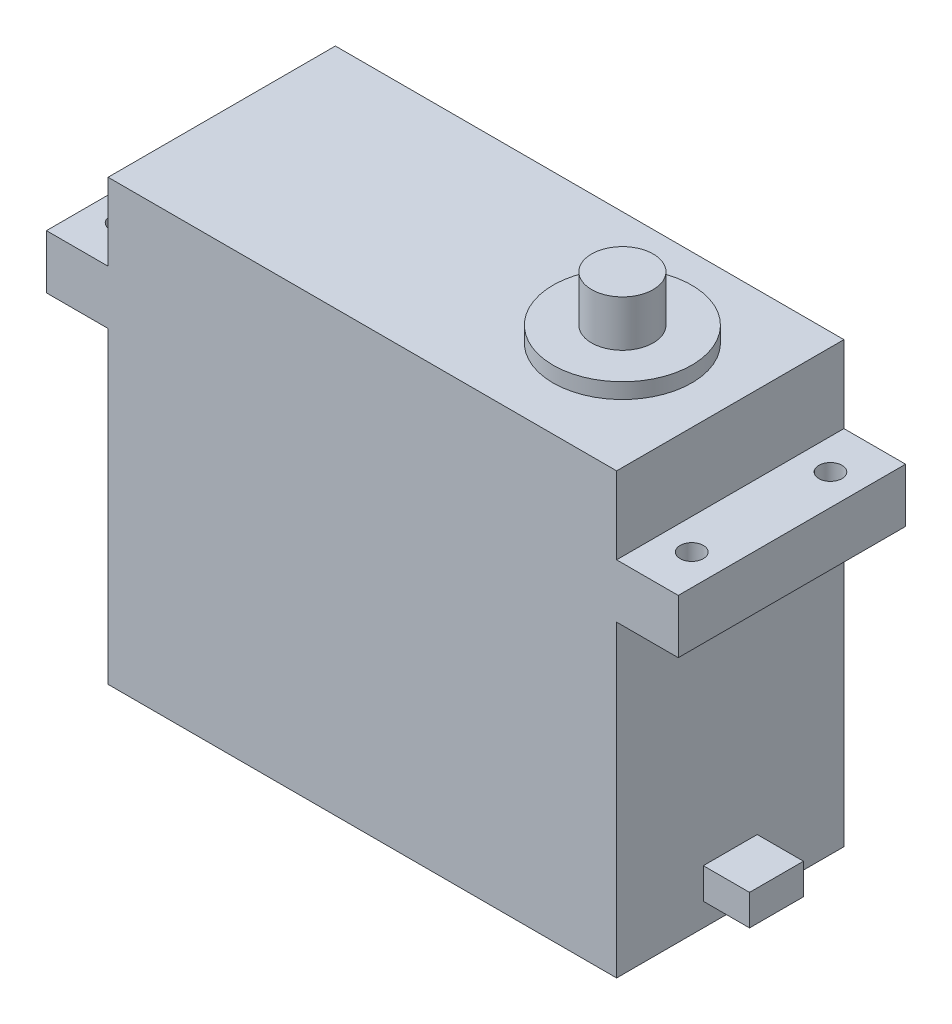
ISO-10303-21;
HEADER;
FILE_DESCRIPTION(('STEP AP214'),'2;1');
FILE_NAME('part.step','',(''),(''),'','','');
FILE_SCHEMA(('AUTOMOTIVE_DESIGN { 1 0 10303 214 1 1 1 1 }'));
ENDSEC;
DATA;
#1=APPLICATION_CONTEXT('core data for automotive mechanical design processes');
#2=APPLICATION_PROTOCOL_DEFINITION('international standard','automotive_design',2000,#1);
#3=PRODUCT_CONTEXT('',#1,'mechanical');
#4=PRODUCT('Part','Part','',(#3));
#5=PRODUCT_RELATED_PRODUCT_CATEGORY('part','',(#4));
#6=PRODUCT_DEFINITION_FORMATION('','',#4);
#7=PRODUCT_DEFINITION_CONTEXT('part definition',#1,'design');
#8=PRODUCT_DEFINITION('design','',#6,#7);
#9=PRODUCT_DEFINITION_SHAPE('','',#8);
#10=(LENGTH_UNIT() NAMED_UNIT(*) SI_UNIT(.MILLI.,.METRE.));
#11=(NAMED_UNIT(*) PLANE_ANGLE_UNIT() SI_UNIT($,.RADIAN.));
#12=(NAMED_UNIT(*) SI_UNIT($,.STERADIAN.) SOLID_ANGLE_UNIT());
#13=UNCERTAINTY_MEASURE_WITH_UNIT(LENGTH_MEASURE(1.E-05),#10,'distance_accuracy_value','');
#14=(GEOMETRIC_REPRESENTATION_CONTEXT(3) GLOBAL_UNCERTAINTY_ASSIGNED_CONTEXT((#13)) GLOBAL_UNIT_ASSIGNED_CONTEXT((#10,
#11,#12)) REPRESENTATION_CONTEXT('',''));
#15=CARTESIAN_POINT('',(0.,0.,0.));
#16=DIRECTION('',(0.,0.,1.));
#17=DIRECTION('',(1.,0.,0.));
#18=AXIS2_PLACEMENT_3D('',#15,#16,#17);
#19=CARTESIAN_POINT('',(14.,57.,-14.75));
#20=DIRECTION('',(-1.,0.,0.));
#21=DIRECTION('',(0.,0.,1.));
#22=AXIS2_PLACEMENT_3D('',#19,#20,#21);
#23=PLANE('',#22);
#24=DIRECTION('',(0.,-1.,0.));
#25=VECTOR('',#24,1.);
#26=CARTESIAN_POINT('',(14.,57.,-14.75));
#27=LINE('',#26,#25);
#28=CARTESIAN_POINT('',(14.,40.,-14.75));
#29=VERTEX_POINT('',#28);
#30=CARTESIAN_POINT('',(14.,0.,-14.75));
#31=VERTEX_POINT('',#30);
#32=EDGE_CURVE('E278',#29,#31,#27,.T.);
#33=ORIENTED_EDGE('',*,*,#32,.F.);
#34=DIRECTION('',(0.,0.,1.));
#35=VECTOR('',#34,1.);
#36=CARTESIAN_POINT('',(14.,40.,-14.75));
#37=LINE('',#36,#35);
#38=CARTESIAN_POINT('',(14.,40.,14.75));
#39=VERTEX_POINT('',#38);
#40=EDGE_CURVE('E231',#29,#39,#37,.T.);
#41=ORIENTED_EDGE('',*,*,#40,.T.);
#42=DIRECTION('',(0.,-1.,0.));
#43=VECTOR('',#42,1.);
#44=CARTESIAN_POINT('',(14.,57.,14.75));
#45=LINE('',#44,#43);
#46=CARTESIAN_POINT('',(14.,0.,14.75));
#47=VERTEX_POINT('',#46);
#48=EDGE_CURVE('E281',#39,#47,#45,.T.);
#49=ORIENTED_EDGE('',*,*,#48,.T.);
#50=DIRECTION('',(0.,0.,-1.));
#51=VECTOR('',#50,1.);
#52=CARTESIAN_POINT('',(14.,0.,-14.75));
#53=LINE('',#52,#51);
#54=EDGE_CURVE('E271',#47,#31,#53,.T.);
#55=ORIENTED_EDGE('',*,*,#54,.T.);
#56=EDGE_LOOP('',(#33,#41,#49,#55));
#57=FACE_BOUND('',#56,.T.);
#58=DIRECTION('',(0.,-1.,0.));
#59=VECTOR('',#58,1.);
#60=CARTESIAN_POINT('',(14.,7.,3.5));
#61=LINE('',#60,#59);
#62=CARTESIAN_POINT('',(14.,7.,3.5));
#63=VERTEX_POINT('',#62);
#64=CARTESIAN_POINT('',(14.,3.,3.5));
#65=VERTEX_POINT('',#64);
#66=EDGE_CURVE('E165',#63,#65,#61,.T.);
#67=ORIENTED_EDGE('',*,*,#66,.F.);
#68=DIRECTION('',(0.,0.,1.));
#69=VECTOR('',#68,1.);
#70=CARTESIAN_POINT('',(14.,7.,3.5));
#71=LINE('',#70,#69);
#72=CARTESIAN_POINT('',(14.,7.,-3.5));
#73=VERTEX_POINT('',#72);
#74=EDGE_CURVE('E162',#73,#63,#71,.T.);
#75=ORIENTED_EDGE('',*,*,#74,.F.);
#76=DIRECTION('',(0.,1.,0.));
#77=VECTOR('',#76,1.);
#78=CARTESIAN_POINT('',(14.,7.,-3.5));
#79=LINE('',#78,#77);
#80=CARTESIAN_POINT('',(14.,3.,-3.5));
#81=VERTEX_POINT('',#80);
#82=EDGE_CURVE('E52',#81,#73,#79,.T.);
#83=ORIENTED_EDGE('',*,*,#82,.F.);
#84=DIRECTION('',(0.,0.,-1.));
#85=VECTOR('',#84,1.);
#86=CARTESIAN_POINT('',(14.,3.,3.5));
#87=LINE('',#86,#85);
#88=EDGE_CURVE('E47',#65,#81,#87,.T.);
#89=ORIENTED_EDGE('',*,*,#88,.F.);
#90=EDGE_LOOP('',(#67,#75,#83,#89));
#91=FACE_BOUND('',#90,.T.);
#92=ADVANCED_FACE('F32',(#57,#91),#23,.F.);
#93=CARTESIAN_POINT('',(-52.,57.,-14.75));
#94=DIRECTION('',(1.,0.,0.));
#95=DIRECTION('',(0.,0.,-1.));
#96=AXIS2_PLACEMENT_3D('',#93,#94,#95);
#97=PLANE('',#96);
#98=DIRECTION('',(0.,0.,-1.));
#99=VECTOR('',#98,1.);
#100=CARTESIAN_POINT('',(-52.,47.,-14.75));
#101=LINE('',#100,#99);
#102=CARTESIAN_POINT('',(-52.,47.,14.75));
#103=VERTEX_POINT('',#102);
#104=CARTESIAN_POINT('',(-52.,47.,-14.75));
#105=VERTEX_POINT('',#104);
#106=EDGE_CURVE('E239',#103,#105,#101,.T.);
#107=ORIENTED_EDGE('',*,*,#106,.F.);
#108=DIRECTION('',(0.,-1.,0.));
#109=VECTOR('',#108,1.);
#110=CARTESIAN_POINT('',(-52.,57.,14.75));
#111=LINE('',#110,#109);
#112=CARTESIAN_POINT('',(-52.,57.,14.75));
#113=VERTEX_POINT('',#112);
#114=EDGE_CURVE('E11',#113,#103,#111,.T.);
#115=ORIENTED_EDGE('',*,*,#114,.F.);
#116=DIRECTION('',(0.,0.,1.));
#117=VECTOR('',#116,1.);
#118=CARTESIAN_POINT('',(-52.,57.,-14.75));
#119=LINE('',#118,#117);
#120=CARTESIAN_POINT('',(-52.,57.,-14.75));
#121=VERTEX_POINT('',#120);
#122=EDGE_CURVE('E255',#121,#113,#119,.T.);
#123=ORIENTED_EDGE('',*,*,#122,.F.);
#124=DIRECTION('',(0.,-1.,0.));
#125=VECTOR('',#124,1.);
#126=CARTESIAN_POINT('',(-52.,57.,-14.75));
#127=LINE('',#126,#125);
#128=EDGE_CURVE('E276',#121,#105,#127,.T.);
#129=ORIENTED_EDGE('',*,*,#128,.T.);
#130=EDGE_LOOP('',(#107,#115,#123,#129));
#131=FACE_BOUND('',#130,.T.);
#132=ADVANCED_FACE('F325',(#131),#97,.F.);
#133=DIRECTION('',(0.,0.,1.));
#134=VECTOR('',#133,1.);
#135=CARTESIAN_POINT('',(14.,47.,-14.75));
#136=LINE('',#135,#134);
#137=CARTESIAN_POINT('',(14.,47.,-14.75));
#138=VERTEX_POINT('',#137);
#139=CARTESIAN_POINT('',(14.,47.,14.75));
#140=VERTEX_POINT('',#139);
#141=EDGE_CURVE('E237',#138,#140,#136,.T.);
#142=ORIENTED_EDGE('',*,*,#141,.F.);
#143=CARTESIAN_POINT('',(14.,57.,-14.75));
#144=VERTEX_POINT('',#143);
#145=EDGE_CURVE('E279',#144,#138,#27,.T.);
#146=ORIENTED_EDGE('',*,*,#145,.F.);
#147=DIRECTION('',(0.,0.,-1.));
#148=VECTOR('',#147,1.);
#149=CARTESIAN_POINT('',(14.,57.,-14.75));
#150=LINE('',#149,#148);
#151=CARTESIAN_POINT('',(14.,57.,14.75));
#152=VERTEX_POINT('',#151);
#153=EDGE_CURVE('E261',#152,#144,#150,.T.);
#154=ORIENTED_EDGE('',*,*,#153,.F.);
#155=EDGE_CURVE('E282',#152,#140,#45,.T.);
#156=ORIENTED_EDGE('',*,*,#155,.T.);
#157=EDGE_LOOP('',(#142,#146,#154,#156));
#158=FACE_BOUND('',#157,.T.);
#159=ADVANCED_FACE('F316',(#158),#23,.F.);
#160=CARTESIAN_POINT('',(0.,59.,0.));
#161=DIRECTION('',(0.,1.,0.));
#162=DIRECTION('',(0.,0.,1.));
#163=AXIS2_PLACEMENT_3D('',#160,#161,#162);
#164=PLANE('',#163);
#165=CARTESIAN_POINT('',(0.,59.,0.));
#166=DIRECTION('',(0.,1.,0.));
#167=DIRECTION('',(0.,0.,1.));
#168=AXIS2_PLACEMENT_3D('',#165,#166,#167);
#169=CIRCLE('',#168,9.);
#170=CARTESIAN_POINT('',(0.,59.,9.));
#171=VERTEX_POINT('',#170);
#172=EDGE_CURVE('E249',#171,#171,#169,.T.);
#173=ORIENTED_EDGE('',*,*,#172,.T.);
#174=EDGE_LOOP('',(#173));
#175=FACE_BOUND('',#174,.T.);
#176=CARTESIAN_POINT('',(0.,59.,0.));
#177=DIRECTION('',(0.,1.,0.));
#178=DIRECTION('',(0.,0.,1.));
#179=AXIS2_PLACEMENT_3D('',#176,#177,#178);
#180=CIRCLE('',#179,4.);
#181=CARTESIAN_POINT('',(0.,59.,4.));
#182=VERTEX_POINT('',#181);
#183=EDGE_CURVE('E242',#182,#182,#180,.T.);
#184=ORIENTED_EDGE('',*,*,#183,.F.);
#185=EDGE_LOOP('',(#184));
#186=FACE_BOUND('',#185,.T.);
#187=ADVANCED_FACE('F345',(#175,#186),#164,.T.);
#188=CARTESIAN_POINT('',(0.,57.,0.));
#189=DIRECTION('',(0.,1.,0.));
#190=DIRECTION('',(0.,0.,1.));
#191=AXIS2_PLACEMENT_3D('',#188,#189,#190);
#192=PLANE('',#191);
#193=ORIENTED_EDGE('',*,*,#122,.T.);
#194=DIRECTION('',(1.,0.,0.));
#195=VECTOR('',#194,1.);
#196=CARTESIAN_POINT('',(-52.,57.,14.75));
#197=LINE('',#196,#195);
#198=EDGE_CURVE('E258',#113,#152,#197,.T.);
#199=ORIENTED_EDGE('',*,*,#198,.T.);
#200=ORIENTED_EDGE('',*,*,#153,.T.);
#201=DIRECTION('',(-1.,0.,0.));
#202=VECTOR('',#201,1.);
#203=CARTESIAN_POINT('',(-52.,57.,-14.75));
#204=LINE('',#203,#202);
#205=EDGE_CURVE('E263',#144,#121,#204,.T.);
#206=ORIENTED_EDGE('',*,*,#205,.T.);
#207=EDGE_LOOP('',(#193,#199,#200,#206));
#208=FACE_BOUND('',#207,.T.);
#209=CARTESIAN_POINT('',(0.,57.,0.));
#210=DIRECTION('',(0.,1.,0.));
#211=DIRECTION('',(0.,0.,1.));
#212=AXIS2_PLACEMENT_3D('',#209,#210,#211);
#213=CIRCLE('',#212,9.);
#214=CARTESIAN_POINT('',(0.,57.,9.));
#215=VERTEX_POINT('',#214);
#216=EDGE_CURVE('E246',#215,#215,#213,.T.);
#217=ORIENTED_EDGE('',*,*,#216,.F.);
#218=EDGE_LOOP('',(#217));
#219=FACE_BOUND('',#218,.T.);
#220=ADVANCED_FACE('F319',(#208,#219),#192,.T.);
#221=CARTESIAN_POINT('',(-52.,40.,14.75));
#222=VERTEX_POINT('',#221);
#223=CARTESIAN_POINT('',(-52.,0.,14.75));
#224=VERTEX_POINT('',#223);
#225=EDGE_CURVE('E40',#222,#224,#111,.T.);
#226=ORIENTED_EDGE('',*,*,#225,.F.);
#227=DIRECTION('',(0.,0.,-1.));
#228=VECTOR('',#227,1.);
#229=CARTESIAN_POINT('',(-52.,40.,-14.75));
#230=LINE('',#229,#228);
#231=CARTESIAN_POINT('',(-52.,40.,-14.75));
#232=VERTEX_POINT('',#231);
#233=EDGE_CURVE('E234',#222,#232,#230,.T.);
#234=ORIENTED_EDGE('',*,*,#233,.T.);
#235=CARTESIAN_POINT('',(-52.,0.,-14.75));
#236=VERTEX_POINT('',#235);
#237=EDGE_CURVE('E265',#232,#236,#127,.T.);
#238=ORIENTED_EDGE('',*,*,#237,.T.);
#239=DIRECTION('',(0.,0.,1.));
#240=VECTOR('',#239,1.);
#241=CARTESIAN_POINT('',(-52.,0.,-14.75));
#242=LINE('',#241,#240);
#243=EDGE_CURVE('E252',#236,#224,#242,.T.);
#244=ORIENTED_EDGE('',*,*,#243,.T.);
#245=EDGE_LOOP('',(#226,#234,#238,#244));
#246=FACE_BOUND('',#245,.T.);
#247=ADVANCED_FACE('F34',(#246),#97,.F.);
#248=CARTESIAN_POINT('',(-52.,57.,14.75));
#249=DIRECTION('',(0.,0.,-1.));
#250=DIRECTION('',(-1.,0.,0.));
#251=AXIS2_PLACEMENT_3D('',#248,#249,#250);
#252=PLANE('',#251);
#253=ORIENTED_EDGE('',*,*,#48,.F.);
#254=DIRECTION('',(1.,0.,0.));
#255=VECTOR('',#254,1.);
#256=CARTESIAN_POINT('',(-60.,40.,14.75));
#257=LINE('',#256,#255);
#258=CARTESIAN_POINT('',(22.,40.,14.75));
#259=VERTEX_POINT('',#258);
#260=EDGE_CURVE('E212',#39,#259,#257,.T.);
#261=ORIENTED_EDGE('',*,*,#260,.T.);
#262=DIRECTION('',(0.,-1.,0.));
#263=VECTOR('',#262,1.);
#264=CARTESIAN_POINT('',(22.,47.,14.75));
#265=LINE('',#264,#263);
#266=CARTESIAN_POINT('',(22.,47.,14.75));
#267=VERTEX_POINT('',#266);
#268=EDGE_CURVE('E225',#267,#259,#265,.T.);
#269=ORIENTED_EDGE('',*,*,#268,.F.);
#270=DIRECTION('',(1.,0.,0.));
#271=VECTOR('',#270,1.);
#272=CARTESIAN_POINT('',(-60.,47.,14.75));
#273=LINE('',#272,#271);
#274=EDGE_CURVE('E199',#140,#267,#273,.T.);
#275=ORIENTED_EDGE('',*,*,#274,.F.);
#276=ORIENTED_EDGE('',*,*,#155,.F.);
#277=ORIENTED_EDGE('',*,*,#198,.F.);
#278=ORIENTED_EDGE('',*,*,#114,.T.);
#279=CARTESIAN_POINT('',(-60.,47.,14.75));
#280=VERTEX_POINT('',#279);
#281=EDGE_CURVE('E201',#280,#103,#273,.T.);
#282=ORIENTED_EDGE('',*,*,#281,.F.);
#283=DIRECTION('',(0.,-1.,0.));
#284=VECTOR('',#283,1.);
#285=CARTESIAN_POINT('',(-60.,47.,14.75));
#286=LINE('',#285,#284);
#287=CARTESIAN_POINT('',(-60.,40.,14.75));
#288=VERTEX_POINT('',#287);
#289=EDGE_CURVE('E228',#280,#288,#286,.T.);
#290=ORIENTED_EDGE('',*,*,#289,.T.);
#291=EDGE_CURVE('E213',#288,#222,#257,.T.);
#292=ORIENTED_EDGE('',*,*,#291,.T.);
#293=ORIENTED_EDGE('',*,*,#225,.T.);
#294=DIRECTION('',(1.,0.,0.));
#295=VECTOR('',#294,1.);
#296=CARTESIAN_POINT('',(-52.,0.,14.75));
#297=LINE('',#296,#295);
#298=EDGE_CURVE('E268',#224,#47,#297,.T.);
#299=ORIENTED_EDGE('',*,*,#298,.T.);
#300=EDGE_LOOP('',(#253,#261,#269,#275,#276,#277,#278,#282,#290,#292,#293,#299));
#301=FACE_BOUND('',#300,.T.);
#302=ADVANCED_FACE('F296',(#301),#252,.F.);
#303=CARTESIAN_POINT('',(-52.,57.,-14.75));
#304=DIRECTION('',(0.,0.,1.));
#305=DIRECTION('',(1.,0.,0.));
#306=AXIS2_PLACEMENT_3D('',#303,#304,#305);
#307=PLANE('',#306);
#308=ORIENTED_EDGE('',*,*,#237,.F.);
#309=DIRECTION('',(-1.,0.,0.));
#310=VECTOR('',#309,1.);
#311=CARTESIAN_POINT('',(-60.,40.,-14.75));
#312=LINE('',#311,#310);
#313=CARTESIAN_POINT('',(-60.,40.,-14.75));
#314=VERTEX_POINT('',#313);
#315=EDGE_CURVE('E218',#232,#314,#312,.T.);
#316=ORIENTED_EDGE('',*,*,#315,.T.);
#317=DIRECTION('',(0.,-1.,0.));
#318=VECTOR('',#317,1.);
#319=CARTESIAN_POINT('',(-60.,47.,-14.75));
#320=LINE('',#319,#318);
#321=CARTESIAN_POINT('',(-60.,47.,-14.75));
#322=VERTEX_POINT('',#321);
#323=EDGE_CURVE('E209',#322,#314,#320,.T.);
#324=ORIENTED_EDGE('',*,*,#323,.F.);
#325=DIRECTION('',(-1.,0.,0.));
#326=VECTOR('',#325,1.);
#327=CARTESIAN_POINT('',(-60.,47.,-14.75));
#328=LINE('',#327,#326);
#329=EDGE_CURVE('E206',#105,#322,#328,.T.);
#330=ORIENTED_EDGE('',*,*,#329,.F.);
#331=ORIENTED_EDGE('',*,*,#128,.F.);
#332=ORIENTED_EDGE('',*,*,#205,.F.);
#333=ORIENTED_EDGE('',*,*,#145,.T.);
#334=CARTESIAN_POINT('',(22.,47.,-14.75));
#335=VERTEX_POINT('',#334);
#336=EDGE_CURVE('E207',#335,#138,#328,.T.);
#337=ORIENTED_EDGE('',*,*,#336,.F.);
#338=DIRECTION('',(0.,-1.,0.));
#339=VECTOR('',#338,1.);
#340=CARTESIAN_POINT('',(22.,47.,-14.75));
#341=LINE('',#340,#339);
#342=CARTESIAN_POINT('',(22.,40.,-14.75));
#343=VERTEX_POINT('',#342);
#344=EDGE_CURVE('E222',#335,#343,#341,.T.);
#345=ORIENTED_EDGE('',*,*,#344,.T.);
#346=EDGE_CURVE('E200',#343,#29,#312,.T.);
#347=ORIENTED_EDGE('',*,*,#346,.T.);
#348=ORIENTED_EDGE('',*,*,#32,.T.);
#349=DIRECTION('',(-1.,0.,0.));
#350=VECTOR('',#349,1.);
#351=CARTESIAN_POINT('',(-52.,0.,-14.75));
#352=LINE('',#351,#350);
#353=EDGE_CURVE('E259',#31,#236,#352,.T.);
#354=ORIENTED_EDGE('',*,*,#353,.T.);
#355=EDGE_LOOP('',(#308,#316,#324,#330,#331,#332,#333,#337,#345,#347,#348,#354));
#356=FACE_BOUND('',#355,.T.);
#357=ADVANCED_FACE('F301',(#356),#307,.F.);
#358=CARTESIAN_POINT('',(0.,0.,0.));
#359=DIRECTION('',(0.,1.,0.));
#360=DIRECTION('',(0.,0.,1.));
#361=AXIS2_PLACEMENT_3D('',#358,#359,#360);
#362=PLANE('',#361);
#363=ORIENTED_EDGE('',*,*,#243,.F.);
#364=ORIENTED_EDGE('',*,*,#353,.F.);
#365=ORIENTED_EDGE('',*,*,#54,.F.);
#366=ORIENTED_EDGE('',*,*,#298,.F.);
#367=EDGE_LOOP('',(#363,#364,#365,#366));
#368=FACE_BOUND('',#367,.T.);
#369=ADVANCED_FACE('F299',(#368),#362,.F.);
#370=CARTESIAN_POINT('',(0.,59.,0.));
#371=DIRECTION('',(0.,-1.,0.));
#372=DIRECTION('',(0.,0.,-1.));
#373=AXIS2_PLACEMENT_3D('',#370,#371,#372);
#374=CYLINDRICAL_SURFACE('',#373,9.);
#375=ORIENTED_EDGE('',*,*,#172,.F.);
#376=EDGE_LOOP('',(#375));
#377=FACE_BOUND('',#376,.T.);
#378=ORIENTED_EDGE('',*,*,#216,.T.);
#379=EDGE_LOOP('',(#378));
#380=FACE_BOUND('',#379,.T.);
#381=ADVANCED_FACE('F366',(#377,#380),#374,.T.);
#382=CARTESIAN_POINT('',(0.,65.,0.));
#383=DIRECTION('',(0.,-1.,0.));
#384=DIRECTION('',(0.,0.,-1.));
#385=AXIS2_PLACEMENT_3D('',#382,#383,#384);
#386=CYLINDRICAL_SURFACE('',#385,4.);
#387=CARTESIAN_POINT('',(0.,65.,0.));
#388=DIRECTION('',(0.,1.,0.));
#389=DIRECTION('',(0.,0.,1.));
#390=AXIS2_PLACEMENT_3D('',#387,#388,#389);
#391=CIRCLE('',#390,4.);
#392=CARTESIAN_POINT('',(0.,65.,4.));
#393=VERTEX_POINT('',#392);
#394=EDGE_CURVE('E243',#393,#393,#391,.T.);
#395=ORIENTED_EDGE('',*,*,#394,.F.);
#396=EDGE_LOOP('',(#395));
#397=FACE_BOUND('',#396,.T.);
#398=ORIENTED_EDGE('',*,*,#183,.T.);
#399=EDGE_LOOP('',(#398));
#400=FACE_BOUND('',#399,.T.);
#401=ADVANCED_FACE('F364',(#397,#400),#386,.T.);
#402=CARTESIAN_POINT('',(0.,65.,0.));
#403=DIRECTION('',(0.,1.,0.));
#404=DIRECTION('',(0.,0.,1.));
#405=AXIS2_PLACEMENT_3D('',#402,#403,#404);
#406=PLANE('',#405);
#407=ORIENTED_EDGE('',*,*,#394,.T.);
#408=EDGE_LOOP('',(#407));
#409=FACE_BOUND('',#408,.T.);
#410=ADVANCED_FACE('F392',(#409),#406,.T.);
#411=CARTESIAN_POINT('',(18.,47.,9.));
#412=DIRECTION('',(0.,-1.,0.));
#413=DIRECTION('',(0.,0.,-1.));
#414=AXIS2_PLACEMENT_3D('',#411,#412,#413);
#415=CYLINDRICAL_SURFACE('',#414,1.5);
#416=CARTESIAN_POINT('',(18.,47.,9.));
#417=DIRECTION('',(0.,1.,0.));
#418=DIRECTION('',(0.,0.,1.));
#419=AXIS2_PLACEMENT_3D('',#416,#417,#418);
#420=CIRCLE('',#419,1.5);
#421=CARTESIAN_POINT('',(18.,47.,10.5));
#422=VERTEX_POINT('',#421);
#423=EDGE_CURVE('E178',#422,#422,#420,.T.);
#424=ORIENTED_EDGE('',*,*,#423,.T.);
#425=EDGE_LOOP('',(#424));
#426=FACE_BOUND('',#425,.T.);
#427=CARTESIAN_POINT('',(18.,40.,9.));
#428=DIRECTION('',(0.,1.,0.));
#429=DIRECTION('',(0.,0.,1.));
#430=AXIS2_PLACEMENT_3D('',#427,#428,#429);
#431=CIRCLE('',#430,1.5);
#432=CARTESIAN_POINT('',(18.,40.,10.5));
#433=VERTEX_POINT('',#432);
#434=EDGE_CURVE('E176',#433,#433,#431,.T.);
#435=ORIENTED_EDGE('',*,*,#434,.F.);
#436=EDGE_LOOP('',(#435));
#437=FACE_BOUND('',#436,.T.);
#438=ADVANCED_FACE('F399',(#426,#437),#415,.F.);
#439=CARTESIAN_POINT('',(18.,47.,-9.));
#440=DIRECTION('',(0.,-1.,0.));
#441=DIRECTION('',(0.,0.,-1.));
#442=AXIS2_PLACEMENT_3D('',#439,#440,#441);
#443=CYLINDRICAL_SURFACE('',#442,1.5);
#444=CARTESIAN_POINT('',(18.,47.,-9.));
#445=DIRECTION('',(0.,1.,0.));
#446=DIRECTION('',(0.,0.,-1.));
#447=AXIS2_PLACEMENT_3D('',#444,#445,#446);
#448=CIRCLE('',#447,1.5);
#449=CARTESIAN_POINT('',(18.,47.,-10.5));
#450=VERTEX_POINT('',#449);
#451=EDGE_CURVE('E169',#450,#450,#448,.T.);
#452=ORIENTED_EDGE('',*,*,#451,.T.);
#453=EDGE_LOOP('',(#452));
#454=FACE_BOUND('',#453,.T.);
#455=CARTESIAN_POINT('',(18.,40.,-9.));
#456=DIRECTION('',(0.,1.,0.));
#457=DIRECTION('',(0.,0.,-1.));
#458=AXIS2_PLACEMENT_3D('',#455,#456,#457);
#459=CIRCLE('',#458,1.5);
#460=CARTESIAN_POINT('',(18.,40.,-10.5));
#461=VERTEX_POINT('',#460);
#462=EDGE_CURVE('E166',#461,#461,#459,.T.);
#463=ORIENTED_EDGE('',*,*,#462,.F.);
#464=EDGE_LOOP('',(#463));
#465=FACE_BOUND('',#464,.T.);
#466=ADVANCED_FACE('F406',(#454,#465),#443,.F.);
#467=CARTESIAN_POINT('',(22.,47.,14.75));
#468=DIRECTION('',(-1.,0.,0.));
#469=DIRECTION('',(0.,0.,1.));
#470=AXIS2_PLACEMENT_3D('',#467,#468,#469);
#471=PLANE('',#470);
#472=DIRECTION('',(0.,0.,-1.));
#473=VECTOR('',#472,1.);
#474=CARTESIAN_POINT('',(22.,40.,14.75));
#475=LINE('',#474,#473);
#476=EDGE_CURVE('E216',#259,#343,#475,.T.);
#477=ORIENTED_EDGE('',*,*,#476,.T.);
#478=ORIENTED_EDGE('',*,*,#344,.F.);
#479=DIRECTION('',(0.,0.,-1.));
#480=VECTOR('',#479,1.);
#481=CARTESIAN_POINT('',(22.,47.,14.75));
#482=LINE('',#481,#480);
#483=EDGE_CURVE('E204',#267,#335,#482,.T.);
#484=ORIENTED_EDGE('',*,*,#483,.F.);
#485=ORIENTED_EDGE('',*,*,#268,.T.);
#486=EDGE_LOOP('',(#477,#478,#484,#485));
#487=FACE_BOUND('',#486,.T.);
#488=ADVANCED_FACE('F312',(#487),#471,.F.);
#489=CARTESIAN_POINT('',(0.,40.,0.));
#490=DIRECTION('',(0.,-1.,0.));
#491=DIRECTION('',(0.,0.,-1.));
#492=AXIS2_PLACEMENT_3D('',#489,#490,#491);
#493=PLANE('',#492);
#494=ORIENTED_EDGE('',*,*,#462,.T.);
#495=EDGE_LOOP('',(#494));
#496=FACE_BOUND('',#495,.T.);
#497=ORIENTED_EDGE('',*,*,#434,.T.);
#498=EDGE_LOOP('',(#497));
#499=FACE_BOUND('',#498,.T.);
#500=ORIENTED_EDGE('',*,*,#40,.F.);
#501=ORIENTED_EDGE('',*,*,#346,.F.);
#502=ORIENTED_EDGE('',*,*,#476,.F.);
#503=ORIENTED_EDGE('',*,*,#260,.F.);
#504=EDGE_LOOP('',(#500,#501,#502,#503));
#505=FACE_BOUND('',#504,.T.);
#506=ADVANCED_FACE('F307',(#496,#499,#505),#493,.T.);
#507=CARTESIAN_POINT('',(0.,47.,0.));
#508=DIRECTION('',(0.,-1.,0.));
#509=DIRECTION('',(0.,0.,-1.));
#510=AXIS2_PLACEMENT_3D('',#507,#508,#509);
#511=PLANE('',#510);
#512=ORIENTED_EDGE('',*,*,#451,.F.);
#513=EDGE_LOOP('',(#512));
#514=FACE_BOUND('',#513,.T.);
#515=ORIENTED_EDGE('',*,*,#423,.F.);
#516=EDGE_LOOP('',(#515));
#517=FACE_BOUND('',#516,.T.);
#518=ORIENTED_EDGE('',*,*,#336,.T.);
#519=ORIENTED_EDGE('',*,*,#141,.T.);
#520=ORIENTED_EDGE('',*,*,#274,.T.);
#521=ORIENTED_EDGE('',*,*,#483,.T.);
#522=EDGE_LOOP('',(#518,#519,#520,#521));
#523=FACE_BOUND('',#522,.T.);
#524=ADVANCED_FACE('F314',(#514,#517,#523),#511,.F.);
#525=CARTESIAN_POINT('',(-56.,47.,9.));
#526=DIRECTION('',(0.,1.,0.));
#527=DIRECTION('',(0.,0.,-1.));
#528=AXIS2_PLACEMENT_3D('',#525,#526,#527);
#529=CIRCLE('',#528,1.5);
#530=CARTESIAN_POINT('',(-56.,47.,7.5));
#531=VERTEX_POINT('',#530);
#532=EDGE_CURVE('E184',#531,#531,#529,.T.);
#533=ORIENTED_EDGE('',*,*,#532,.F.);
#534=EDGE_LOOP('',(#533));
#535=FACE_BOUND('',#534,.T.);
#536=CARTESIAN_POINT('',(-56.,47.,-9.));
#537=DIRECTION('',(0.,1.,0.));
#538=DIRECTION('',(0.,0.,1.));
#539=AXIS2_PLACEMENT_3D('',#536,#537,#538);
#540=CIRCLE('',#539,1.5);
#541=CARTESIAN_POINT('',(-56.,47.,-7.5));
#542=VERTEX_POINT('',#541);
#543=EDGE_CURVE('E190',#542,#542,#540,.T.);
#544=ORIENTED_EDGE('',*,*,#543,.F.);
#545=EDGE_LOOP('',(#544));
#546=FACE_BOUND('',#545,.T.);
#547=ORIENTED_EDGE('',*,*,#281,.T.);
#548=ORIENTED_EDGE('',*,*,#106,.T.);
#549=ORIENTED_EDGE('',*,*,#329,.T.);
#550=DIRECTION('',(0.,0.,1.));
#551=VECTOR('',#550,1.);
#552=CARTESIAN_POINT('',(-60.,47.,14.75));
#553=LINE('',#552,#551);
#554=EDGE_CURVE('E196',#322,#280,#553,.T.);
#555=ORIENTED_EDGE('',*,*,#554,.T.);
#556=EDGE_LOOP('',(#547,#548,#549,#555));
#557=FACE_BOUND('',#556,.T.);
#558=ADVANCED_FACE('F327',(#535,#546,#557),#511,.F.);
#559=CARTESIAN_POINT('',(-56.,40.,9.));
#560=DIRECTION('',(0.,1.,0.));
#561=DIRECTION('',(0.,0.,-1.));
#562=AXIS2_PLACEMENT_3D('',#559,#560,#561);
#563=CIRCLE('',#562,1.5);
#564=CARTESIAN_POINT('',(-56.,40.,7.5));
#565=VERTEX_POINT('',#564);
#566=EDGE_CURVE('E181',#565,#565,#563,.T.);
#567=ORIENTED_EDGE('',*,*,#566,.T.);
#568=EDGE_LOOP('',(#567));
#569=FACE_BOUND('',#568,.T.);
#570=CARTESIAN_POINT('',(-56.,40.,-9.));
#571=DIRECTION('',(0.,1.,0.));
#572=DIRECTION('',(0.,0.,1.));
#573=AXIS2_PLACEMENT_3D('',#570,#571,#572);
#574=CIRCLE('',#573,1.5);
#575=CARTESIAN_POINT('',(-56.,40.,-7.5));
#576=VERTEX_POINT('',#575);
#577=EDGE_CURVE('E187',#576,#576,#574,.T.);
#578=ORIENTED_EDGE('',*,*,#577,.T.);
#579=EDGE_LOOP('',(#578));
#580=FACE_BOUND('',#579,.T.);
#581=ORIENTED_EDGE('',*,*,#233,.F.);
#582=ORIENTED_EDGE('',*,*,#291,.F.);
#583=DIRECTION('',(0.,0.,1.));
#584=VECTOR('',#583,1.);
#585=CARTESIAN_POINT('',(-60.,40.,14.75));
#586=LINE('',#585,#584);
#587=EDGE_CURVE('E193',#314,#288,#586,.T.);
#588=ORIENTED_EDGE('',*,*,#587,.F.);
#589=ORIENTED_EDGE('',*,*,#315,.F.);
#590=EDGE_LOOP('',(#581,#582,#588,#589));
#591=FACE_BOUND('',#590,.T.);
#592=ADVANCED_FACE('F337',(#569,#580,#591),#493,.T.);
#593=CARTESIAN_POINT('',(-60.,47.,14.75));
#594=DIRECTION('',(1.,0.,0.));
#595=DIRECTION('',(0.,0.,-1.));
#596=AXIS2_PLACEMENT_3D('',#593,#594,#595);
#597=PLANE('',#596);
#598=ORIENTED_EDGE('',*,*,#587,.T.);
#599=ORIENTED_EDGE('',*,*,#289,.F.);
#600=ORIENTED_EDGE('',*,*,#554,.F.);
#601=ORIENTED_EDGE('',*,*,#323,.T.);
#602=EDGE_LOOP('',(#598,#599,#600,#601));
#603=FACE_BOUND('',#602,.T.);
#604=ADVANCED_FACE('F333',(#603),#597,.F.);
#605=CARTESIAN_POINT('',(-56.,47.,-9.));
#606=DIRECTION('',(0.,-1.,0.));
#607=DIRECTION('',(0.,0.,-1.));
#608=AXIS2_PLACEMENT_3D('',#605,#606,#607);
#609=CYLINDRICAL_SURFACE('',#608,1.5);
#610=ORIENTED_EDGE('',*,*,#543,.T.);
#611=EDGE_LOOP('',(#610));
#612=FACE_BOUND('',#611,.T.);
#613=ORIENTED_EDGE('',*,*,#577,.F.);
#614=EDGE_LOOP('',(#613));
#615=FACE_BOUND('',#614,.T.);
#616=ADVANCED_FACE('F453',(#612,#615),#609,.F.);
#617=CARTESIAN_POINT('',(-56.,47.,9.));
#618=DIRECTION('',(0.,-1.,0.));
#619=DIRECTION('',(0.,0.,-1.));
#620=AXIS2_PLACEMENT_3D('',#617,#618,#619);
#621=CYLINDRICAL_SURFACE('',#620,1.5);
#622=ORIENTED_EDGE('',*,*,#532,.T.);
#623=EDGE_LOOP('',(#622));
#624=FACE_BOUND('',#623,.T.);
#625=ORIENTED_EDGE('',*,*,#566,.F.);
#626=EDGE_LOOP('',(#625));
#627=FACE_BOUND('',#626,.T.);
#628=ADVANCED_FACE('F460',(#624,#627),#621,.F.);
#629=CARTESIAN_POINT('',(20.,7.,3.5));
#630=DIRECTION('',(0.,0.,-1.));
#631=DIRECTION('',(-1.,0.,0.));
#632=AXIS2_PLACEMENT_3D('',#629,#630,#631);
#633=PLANE('',#632);
#634=ORIENTED_EDGE('',*,*,#66,.T.);
#635=DIRECTION('',(-1.,0.,0.));
#636=VECTOR('',#635,1.);
#637=CARTESIAN_POINT('',(20.,3.,3.5));
#638=LINE('',#637,#636);
#639=CARTESIAN_POINT('',(20.,3.,3.5));
#640=VERTEX_POINT('',#639);
#641=EDGE_CURVE('E146',#640,#65,#638,.T.);
#642=ORIENTED_EDGE('',*,*,#641,.F.);
#643=DIRECTION('',(0.,-1.,0.));
#644=VECTOR('',#643,1.);
#645=CARTESIAN_POINT('',(20.,7.,3.5));
#646=LINE('',#645,#644);
#647=CARTESIAN_POINT('',(20.,7.,3.5));
#648=VERTEX_POINT('',#647);
#649=EDGE_CURVE('E153',#648,#640,#646,.T.);
#650=ORIENTED_EDGE('',*,*,#649,.F.);
#651=DIRECTION('',(-1.,0.,0.));
#652=VECTOR('',#651,1.);
#653=CARTESIAN_POINT('',(20.,7.,3.5));
#654=LINE('',#653,#652);
#655=EDGE_CURVE('E583',#648,#63,#654,.T.);
#656=ORIENTED_EDGE('',*,*,#655,.T.);
#657=EDGE_LOOP('',(#634,#642,#650,#656));
#658=FACE_BOUND('',#657,.T.);
#659=ADVANCED_FACE('F164',(#658),#633,.F.);
#660=CARTESIAN_POINT('',(20.,3.,3.5));
#661=DIRECTION('',(0.,1.,0.));
#662=DIRECTION('',(0.,0.,1.));
#663=AXIS2_PLACEMENT_3D('',#660,#661,#662);
#664=PLANE('',#663);
#665=ORIENTED_EDGE('',*,*,#88,.T.);
#666=DIRECTION('',(-1.,0.,0.));
#667=VECTOR('',#666,1.);
#668=CARTESIAN_POINT('',(20.,3.,-3.5));
#669=LINE('',#668,#667);
#670=CARTESIAN_POINT('',(20.,3.,-3.5));
#671=VERTEX_POINT('',#670);
#672=EDGE_CURVE('E149',#671,#81,#669,.T.);
#673=ORIENTED_EDGE('',*,*,#672,.F.);
#674=DIRECTION('',(0.,0.,-1.));
#675=VECTOR('',#674,1.);
#676=CARTESIAN_POINT('',(20.,3.,3.5));
#677=LINE('',#676,#675);
#678=EDGE_CURVE('E142',#640,#671,#677,.T.);
#679=ORIENTED_EDGE('',*,*,#678,.F.);
#680=ORIENTED_EDGE('',*,*,#641,.T.);
#681=EDGE_LOOP('',(#665,#673,#679,#680));
#682=FACE_BOUND('',#681,.T.);
#683=ADVANCED_FACE('F144',(#682),#664,.F.);
#684=CARTESIAN_POINT('',(20.,7.,-3.5));
#685=DIRECTION('',(0.,0.,1.));
#686=DIRECTION('',(1.,0.,0.));
#687=AXIS2_PLACEMENT_3D('',#684,#685,#686);
#688=PLANE('',#687);
#689=ORIENTED_EDGE('',*,*,#82,.T.);
#690=DIRECTION('',(-1.,0.,0.));
#691=VECTOR('',#690,1.);
#692=CARTESIAN_POINT('',(20.,7.,-3.5));
#693=LINE('',#692,#691);
#694=CARTESIAN_POINT('',(20.,7.,-3.5));
#695=VERTEX_POINT('',#694);
#696=EDGE_CURVE('E171',#695,#73,#693,.T.);
#697=ORIENTED_EDGE('',*,*,#696,.F.);
#698=DIRECTION('',(0.,1.,0.));
#699=VECTOR('',#698,1.);
#700=CARTESIAN_POINT('',(20.,7.,-3.5));
#701=LINE('',#700,#699);
#702=EDGE_CURVE('E152',#671,#695,#701,.T.);
#703=ORIENTED_EDGE('',*,*,#702,.F.);
#704=ORIENTED_EDGE('',*,*,#672,.T.);
#705=EDGE_LOOP('',(#689,#697,#703,#704));
#706=FACE_BOUND('',#705,.T.);
#707=ADVANCED_FACE('F481',(#706),#688,.F.);
#708=CARTESIAN_POINT('',(20.,7.,3.5));
#709=DIRECTION('',(0.,-1.,0.));
#710=DIRECTION('',(0.,0.,-1.));
#711=AXIS2_PLACEMENT_3D('',#708,#709,#710);
#712=PLANE('',#711);
#713=ORIENTED_EDGE('',*,*,#74,.T.);
#714=ORIENTED_EDGE('',*,*,#655,.F.);
#715=DIRECTION('',(0.,0.,1.));
#716=VECTOR('',#715,1.);
#717=CARTESIAN_POINT('',(20.,7.,3.5));
#718=LINE('',#717,#716);
#719=EDGE_CURVE('E158',#695,#648,#718,.T.);
#720=ORIENTED_EDGE('',*,*,#719,.F.);
#721=ORIENTED_EDGE('',*,*,#696,.T.);
#722=EDGE_LOOP('',(#713,#714,#720,#721));
#723=FACE_BOUND('',#722,.T.);
#724=ADVANCED_FACE('F488',(#723),#712,.F.);
#725=CARTESIAN_POINT('',(20.,0.,0.));
#726=DIRECTION('',(1.,0.,0.));
#727=DIRECTION('',(0.,0.,-1.));
#728=AXIS2_PLACEMENT_3D('',#725,#726,#727);
#729=PLANE('',#728);
#730=ORIENTED_EDGE('',*,*,#649,.T.);
#731=ORIENTED_EDGE('',*,*,#678,.T.);
#732=ORIENTED_EDGE('',*,*,#702,.T.);
#733=ORIENTED_EDGE('',*,*,#719,.T.);
#734=EDGE_LOOP('',(#730,#731,#732,#733));
#735=FACE_BOUND('',#734,.T.);
#736=ADVANCED_FACE('F156',(#735),#729,.T.);
#737=CLOSED_SHELL('',(#92,#132,#159,#187,#220,#247,#302,#357,#369,#381,#401,#410,#438,#466,#488,
#506,#524,#558,#592,#604,#616,#628,#659,#683,#707,#724,#736));
#738=MANIFOLD_SOLID_BREP('B2',#737);
#739=ADVANCED_BREP_SHAPE_REPRESENTATION('',(#18,#738),#14);
#740=SHAPE_DEFINITION_REPRESENTATION(#9,#739);
ENDSEC;
END-ISO-10303-21;
